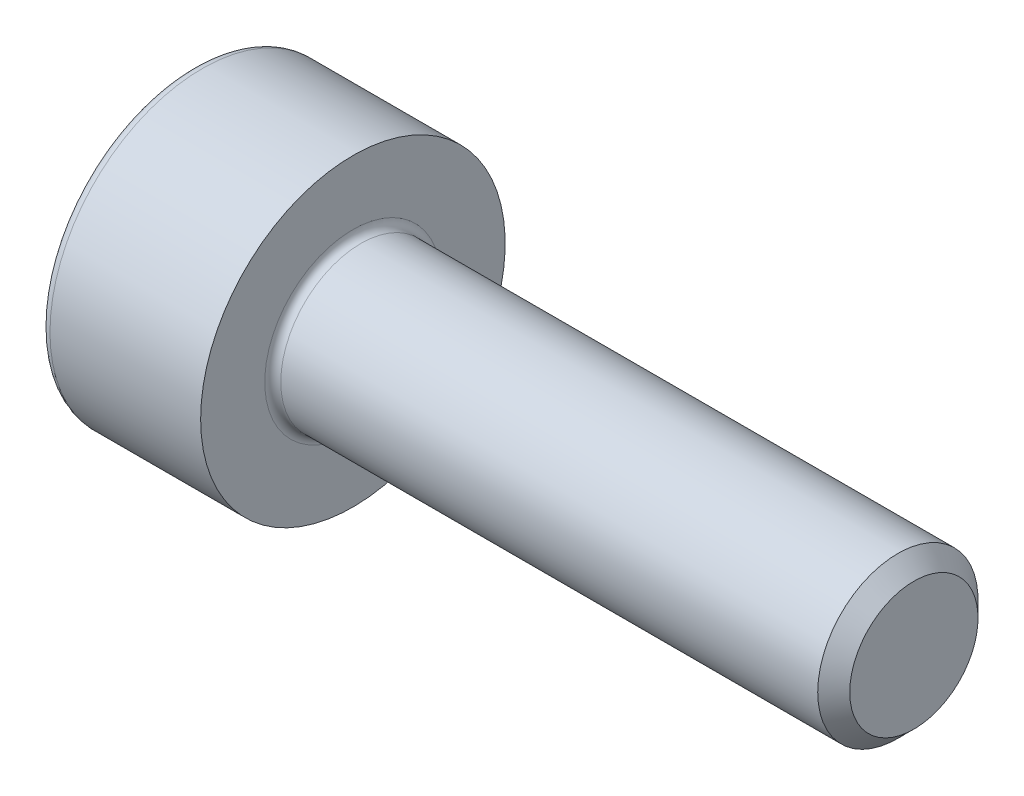
ISO-10303-21;
HEADER;
FILE_DESCRIPTION(('STEP AP214'),'2;1');
FILE_NAME('part.step','',(''),(''),'','','');
FILE_SCHEMA(('AUTOMOTIVE_DESIGN { 1 0 10303 214 1 1 1 1 }'));
ENDSEC;
DATA;
#1=APPLICATION_CONTEXT('core data for automotive mechanical design processes');
#2=APPLICATION_PROTOCOL_DEFINITION('international standard','automotive_design',2000,#1);
#3=PRODUCT_CONTEXT('',#1,'mechanical');
#4=PRODUCT('Part','Part','',(#3));
#5=PRODUCT_RELATED_PRODUCT_CATEGORY('part','',(#4));
#6=PRODUCT_DEFINITION_FORMATION('','',#4);
#7=PRODUCT_DEFINITION_CONTEXT('part definition',#1,'design');
#8=PRODUCT_DEFINITION('design','',#6,#7);
#9=PRODUCT_DEFINITION_SHAPE('','',#8);
#10=(LENGTH_UNIT() NAMED_UNIT(*) SI_UNIT(.MILLI.,.METRE.));
#11=(NAMED_UNIT(*) PLANE_ANGLE_UNIT() SI_UNIT($,.RADIAN.));
#12=(NAMED_UNIT(*) SI_UNIT($,.STERADIAN.) SOLID_ANGLE_UNIT());
#13=UNCERTAINTY_MEASURE_WITH_UNIT(LENGTH_MEASURE(1.E-05),#10,'distance_accuracy_value','');
#14=(GEOMETRIC_REPRESENTATION_CONTEXT(3) GLOBAL_UNCERTAINTY_ASSIGNED_CONTEXT((#13)) GLOBAL_UNIT_ASSIGNED_CONTEXT((#10,
#11,#12)) REPRESENTATION_CONTEXT('',''));
#15=CARTESIAN_POINT('',(0.,0.,0.));
#16=DIRECTION('',(0.,0.,1.));
#17=DIRECTION('',(1.,0.,0.));
#18=AXIS2_PLACEMENT_3D('',#15,#16,#17);
#19=CARTESIAN_POINT('',(9.00000000000477,0.,0.));
#20=DIRECTION('',(-1.,0.,0.));
#21=DIRECTION('',(0.,0.,1.));
#22=AXIS2_PLACEMENT_3D('',#19,#20,#21);
#23=PLANE('',#22);
#24=CARTESIAN_POINT('',(9.00000000000477,0.,0.));
#25=DIRECTION('',(-1.,0.,0.));
#26=DIRECTION('',(0.,0.,1.));
#27=AXIS2_PLACEMENT_3D('',#24,#25,#26);
#28=CIRCLE('',#27,0.800000000000005);
#29=CARTESIAN_POINT('',(9.00000000000477,0.,0.800000000000005));
#30=VERTEX_POINT('',#29);
#31=EDGE_CURVE('E11',#30,#30,#28,.F.);
#32=ORIENTED_EDGE('',*,*,#31,.T.);
#33=EDGE_LOOP('',(#32));
#34=FACE_BOUND('',#33,.T.);
#35=ADVANCED_FACE('F37',(#34),#23,.F.);
#36=CARTESIAN_POINT('',(0.,0.,0.));
#37=DIRECTION('',(-1.,0.,0.));
#38=DIRECTION('',(0.,0.,1.));
#39=AXIS2_PLACEMENT_3D('',#36,#37,#38);
#40=CYLINDRICAL_SURFACE('',#39,1.);
#41=CARTESIAN_POINT('',(8.80000000000478,0.,0.));
#42=DIRECTION('',(-1.,0.,0.));
#43=DIRECTION('',(0.,0.,1.));
#44=AXIS2_PLACEMENT_3D('',#41,#42,#43);
#45=CIRCLE('',#44,1.);
#46=CARTESIAN_POINT('',(8.80000000000478,0.,1.));
#47=VERTEX_POINT('',#46);
#48=EDGE_CURVE('E45',#47,#47,#45,.T.);
#49=ORIENTED_EDGE('',*,*,#48,.T.);
#50=EDGE_LOOP('',(#49));
#51=FACE_BOUND('',#50,.T.);
#52=CARTESIAN_POINT('',(2.10000000000477,0.,0.));
#53=DIRECTION('',(1.,0.,0.));
#54=DIRECTION('',(0.,0.,-1.));
#55=AXIS2_PLACEMENT_3D('',#52,#53,#54);
#56=CIRCLE('',#55,1.);
#57=CARTESIAN_POINT('',(2.10000000000477,0.,-1.));
#58=VERTEX_POINT('',#57);
#59=EDGE_CURVE('E150',#58,#58,#56,.T.);
#60=ORIENTED_EDGE('',*,*,#59,.T.);
#61=EDGE_LOOP('',(#60));
#62=FACE_BOUND('',#61,.T.);
#63=ADVANCED_FACE('F161',(#51,#62),#40,.T.);
#64=CARTESIAN_POINT('',(2.00000000000477,0.,0.));
#65=DIRECTION('',(1.,0.,0.));
#66=DIRECTION('',(0.,0.,-1.));
#67=AXIS2_PLACEMENT_3D('',#64,#65,#66);
#68=PLANE('',#67);
#69=CARTESIAN_POINT('',(2.00000000000477,0.,0.));
#70=DIRECTION('',(1.,0.,0.));
#71=DIRECTION('',(0.,0.,-1.));
#72=AXIS2_PLACEMENT_3D('',#69,#70,#71);
#73=CIRCLE('',#72,1.1);
#74=CARTESIAN_POINT('',(2.00000000000477,0.,-1.1));
#75=VERTEX_POINT('',#74);
#76=EDGE_CURVE('E147',#75,#75,#73,.F.);
#77=ORIENTED_EDGE('',*,*,#76,.T.);
#78=EDGE_LOOP('',(#77));
#79=FACE_BOUND('',#78,.T.);
#80=CARTESIAN_POINT('',(2.00000000000477,0.,0.));
#81=DIRECTION('',(-1.,0.,0.));
#82=DIRECTION('',(0.,0.,1.));
#83=AXIS2_PLACEMENT_3D('',#80,#81,#82);
#84=CIRCLE('',#83,1.9);
#85=CARTESIAN_POINT('',(2.00000000000477,0.,1.9));
#86=VERTEX_POINT('',#85);
#87=EDGE_CURVE('E139',#86,#86,#84,.T.);
#88=ORIENTED_EDGE('',*,*,#87,.F.);
#89=EDGE_LOOP('',(#88));
#90=FACE_BOUND('',#89,.T.);
#91=ADVANCED_FACE('F183',(#79,#90),#68,.T.);
#92=CARTESIAN_POINT('',(0.,0.,0.));
#93=DIRECTION('',(-1.,0.,0.));
#94=DIRECTION('',(0.,0.,1.));
#95=AXIS2_PLACEMENT_3D('',#92,#93,#94);
#96=CYLINDRICAL_SURFACE('',#95,1.9);
#97=CARTESIAN_POINT('',(0.12,0.,0.));
#98=DIRECTION('',(-1.,0.,0.));
#99=DIRECTION('',(0.,0.,1.));
#100=AXIS2_PLACEMENT_3D('',#97,#98,#99);
#101=CIRCLE('',#100,1.9);
#102=CARTESIAN_POINT('',(0.12,0.,1.9));
#103=VERTEX_POINT('',#102);
#104=EDGE_CURVE('E156',#103,#103,#101,.F.);
#105=ORIENTED_EDGE('',*,*,#104,.T.);
#106=EDGE_LOOP('',(#105));
#107=FACE_BOUND('',#106,.T.);
#108=ORIENTED_EDGE('',*,*,#87,.T.);
#109=EDGE_LOOP('',(#108));
#110=FACE_BOUND('',#109,.T.);
#111=ADVANCED_FACE('F193',(#107,#110),#96,.T.);
#112=CARTESIAN_POINT('',(0.,0.,0.));
#113=DIRECTION('',(-1.,0.,0.));
#114=DIRECTION('',(0.,0.,1.));
#115=AXIS2_PLACEMENT_3D('',#112,#113,#114);
#116=PLANE('',#115);
#117=DIRECTION('',(0.,0.5,-0.866025403784439));
#118=VECTOR('',#117,1.);
#119=CARTESIAN_POINT('',(0.,0.43301270189222,0.749999999999999));
#120=LINE('',#119,#118);
#121=CARTESIAN_POINT('',(0.,0.43301270189222,0.749999999999999));
#122=VERTEX_POINT('',#121);
#123=CARTESIAN_POINT('',(0.,0.866025403784438,0.));
#124=VERTEX_POINT('',#123);
#125=EDGE_CURVE('E52',#122,#124,#120,.T.);
#126=ORIENTED_EDGE('',*,*,#125,.F.);
#127=DIRECTION('',(0.,1.,0.));
#128=VECTOR('',#127,1.);
#129=CARTESIAN_POINT('',(0.,-0.43301270189222,0.749999999999999));
#130=LINE('',#129,#128);
#131=CARTESIAN_POINT('',(0.,-0.43301270189222,0.749999999999999));
#132=VERTEX_POINT('',#131);
#133=EDGE_CURVE('E135',#132,#122,#130,.T.);
#134=ORIENTED_EDGE('',*,*,#133,.F.);
#135=DIRECTION('',(0.,0.5,0.866025403784439));
#136=VECTOR('',#135,1.);
#137=CARTESIAN_POINT('',(0.,-0.866025403784438,0.));
#138=LINE('',#137,#136);
#139=CARTESIAN_POINT('',(0.,-0.866025403784438,0.));
#140=VERTEX_POINT('',#139);
#141=EDGE_CURVE('E133',#140,#132,#138,.T.);
#142=ORIENTED_EDGE('',*,*,#141,.F.);
#143=DIRECTION('',(0.,-0.5,0.866025403784439));
#144=VECTOR('',#143,1.);
#145=CARTESIAN_POINT('',(0.,-0.433012701892219,-0.75));
#146=LINE('',#145,#144);
#147=CARTESIAN_POINT('',(0.,-0.433012701892219,-0.75));
#148=VERTEX_POINT('',#147);
#149=EDGE_CURVE('E100',#148,#140,#146,.T.);
#150=ORIENTED_EDGE('',*,*,#149,.F.);
#151=DIRECTION('',(0.,-1.,0.));
#152=VECTOR('',#151,1.);
#153=CARTESIAN_POINT('',(0.,0.433012701892219,-0.75));
#154=LINE('',#153,#152);
#155=CARTESIAN_POINT('',(0.,0.433012701892219,-0.75));
#156=VERTEX_POINT('',#155);
#157=EDGE_CURVE('E129',#156,#148,#154,.T.);
#158=ORIENTED_EDGE('',*,*,#157,.F.);
#159=DIRECTION('',(0.,-0.5,-0.866025403784439));
#160=VECTOR('',#159,1.);
#161=CARTESIAN_POINT('',(0.,0.866025403784438,0.));
#162=LINE('',#161,#160);
#163=EDGE_CURVE('E126',#124,#156,#162,.T.);
#164=ORIENTED_EDGE('',*,*,#163,.F.);
#165=EDGE_LOOP('',(#126,#134,#142,#150,#158,#164));
#166=FACE_BOUND('',#165,.T.);
#167=CARTESIAN_POINT('',(0.,0.,0.));
#168=DIRECTION('',(-1.,0.,0.));
#169=DIRECTION('',(0.,0.,1.));
#170=AXIS2_PLACEMENT_3D('',#167,#168,#169);
#171=CIRCLE('',#170,1.78);
#172=CARTESIAN_POINT('',(0.,0.,1.78));
#173=VERTEX_POINT('',#172);
#174=EDGE_CURVE('E153',#173,#173,#171,.T.);
#175=ORIENTED_EDGE('',*,*,#174,.T.);
#176=EDGE_LOOP('',(#175));
#177=FACE_BOUND('',#176,.T.);
#178=ADVANCED_FACE('F188',(#166,#177),#116,.T.);
#179=CARTESIAN_POINT('',(2.10000000000477,0.,0.));
#180=DIRECTION('',(1.,0.,0.));
#181=DIRECTION('',(0.,0.,-1.));
#182=AXIS2_PLACEMENT_3D('',#179,#180,#181);
#183=TOROIDAL_SURFACE('',#182,1.1,0.1);
#184=ORIENTED_EDGE('',*,*,#59,.F.);
#185=EDGE_LOOP('',(#184));
#186=FACE_BOUND('',#185,.T.);
#187=ORIENTED_EDGE('',*,*,#76,.F.);
#188=EDGE_LOOP('',(#187));
#189=FACE_BOUND('',#188,.T.);
#190=ADVANCED_FACE('F174',(#186,#189),#183,.F.);
#191=CARTESIAN_POINT('',(0.12,0.,0.));
#192=DIRECTION('',(-1.,0.,0.));
#193=DIRECTION('',(0.,0.,1.));
#194=AXIS2_PLACEMENT_3D('',#191,#192,#193);
#195=TOROIDAL_SURFACE('',#194,1.78,0.12);
#196=ORIENTED_EDGE('',*,*,#104,.F.);
#197=EDGE_LOOP('',(#196));
#198=FACE_BOUND('',#197,.T.);
#199=ORIENTED_EDGE('',*,*,#174,.F.);
#200=EDGE_LOOP('',(#199));
#201=FACE_BOUND('',#200,.T.);
#202=ADVANCED_FACE('F166',(#198,#201),#195,.T.);
#203=CARTESIAN_POINT('',(8.80000000000478,0.,0.));
#204=DIRECTION('',(-1.,0.,0.));
#205=DIRECTION('',(0.,0.,1.));
#206=AXIS2_PLACEMENT_3D('',#203,#204,#205);
#207=CONICAL_SURFACE('',#206,1.,0.785398163397446);
#208=ORIENTED_EDGE('',*,*,#31,.F.);
#209=EDGE_LOOP('',(#208));
#210=FACE_BOUND('',#209,.T.);
#211=ORIENTED_EDGE('',*,*,#48,.F.);
#212=EDGE_LOOP('',(#211));
#213=FACE_BOUND('',#212,.T.);
#214=ADVANCED_FACE('F39',(#210,#213),#207,.T.);
#215=CARTESIAN_POINT('',(1.,0.43301270189222,0.749999999999999));
#216=DIRECTION('',(0.,0.866025403784439,0.5));
#217=DIRECTION('',(0.,-0.5,0.866025403784439));
#218=AXIS2_PLACEMENT_3D('',#215,#216,#217);
#219=PLANE('',#218);
#220=ORIENTED_EDGE('',*,*,#125,.T.);
#221=DIRECTION('',(-1.,0.,0.));
#222=VECTOR('',#221,1.);
#223=CARTESIAN_POINT('',(1.,0.866025403784438,0.));
#224=LINE('',#223,#222);
#225=CARTESIAN_POINT('',(1.,0.866025403784438,0.));
#226=VERTEX_POINT('',#225);
#227=EDGE_CURVE('E82',#226,#124,#224,.T.);
#228=ORIENTED_EDGE('',*,*,#227,.F.);
#229=DIRECTION('',(0.,0.5,-0.866025403784439));
#230=VECTOR('',#229,1.);
#231=CARTESIAN_POINT('',(1.,0.43301270189222,0.749999999999999));
#232=LINE('',#231,#230);
#233=CARTESIAN_POINT('',(1.,0.43301270189222,0.749999999999999));
#234=VERTEX_POINT('',#233);
#235=EDGE_CURVE('E137',#234,#226,#232,.T.);
#236=ORIENTED_EDGE('',*,*,#235,.F.);
#237=DIRECTION('',(-1.,0.,0.));
#238=VECTOR('',#237,1.);
#239=CARTESIAN_POINT('',(1.,0.43301270189222,0.749999999999999));
#240=LINE('',#239,#238);
#241=EDGE_CURVE('E60',#234,#122,#240,.T.);
#242=ORIENTED_EDGE('',*,*,#241,.T.);
#243=EDGE_LOOP('',(#220,#228,#236,#242));
#244=FACE_BOUND('',#243,.T.);
#245=ADVANCED_FACE('F165',(#244),#219,.F.);
#246=CARTESIAN_POINT('',(1.,-0.43301270189222,0.749999999999999));
#247=DIRECTION('',(0.,0.,1.));
#248=DIRECTION('',(0.,-1.,0.));
#249=AXIS2_PLACEMENT_3D('',#246,#247,#248);
#250=PLANE('',#249);
#251=ORIENTED_EDGE('',*,*,#133,.T.);
#252=ORIENTED_EDGE('',*,*,#241,.F.);
#253=DIRECTION('',(0.,1.,0.));
#254=VECTOR('',#253,1.);
#255=CARTESIAN_POINT('',(1.,-0.43301270189222,0.749999999999999));
#256=LINE('',#255,#254);
#257=CARTESIAN_POINT('',(1.,-0.43301270189222,0.749999999999999));
#258=VERTEX_POINT('',#257);
#259=EDGE_CURVE('E112',#258,#234,#256,.T.);
#260=ORIENTED_EDGE('',*,*,#259,.F.);
#261=DIRECTION('',(-1.,0.,0.));
#262=VECTOR('',#261,1.);
#263=CARTESIAN_POINT('',(1.,-0.43301270189222,0.749999999999999));
#264=LINE('',#263,#262);
#265=EDGE_CURVE('E104',#258,#132,#264,.T.);
#266=ORIENTED_EDGE('',*,*,#265,.T.);
#267=EDGE_LOOP('',(#251,#252,#260,#266));
#268=FACE_BOUND('',#267,.T.);
#269=ADVANCED_FACE('F172',(#268),#250,.F.);
#270=CARTESIAN_POINT('',(1.,-0.866025403784438,0.));
#271=DIRECTION('',(0.,-0.866025403784439,0.5));
#272=DIRECTION('',(0.,-0.5,-0.866025403784439));
#273=AXIS2_PLACEMENT_3D('',#270,#271,#272);
#274=PLANE('',#273);
#275=ORIENTED_EDGE('',*,*,#141,.T.);
#276=ORIENTED_EDGE('',*,*,#265,.F.);
#277=DIRECTION('',(0.,0.5,0.866025403784439));
#278=VECTOR('',#277,1.);
#279=CARTESIAN_POINT('',(1.,-0.866025403784438,0.));
#280=LINE('',#279,#278);
#281=CARTESIAN_POINT('',(1.,-0.866025403784438,0.));
#282=VERTEX_POINT('',#281);
#283=EDGE_CURVE('E108',#282,#258,#280,.T.);
#284=ORIENTED_EDGE('',*,*,#283,.F.);
#285=DIRECTION('',(-1.,0.,0.));
#286=VECTOR('',#285,1.);
#287=CARTESIAN_POINT('',(1.,-0.866025403784438,0.));
#288=LINE('',#287,#286);
#289=EDGE_CURVE('E93',#282,#140,#288,.T.);
#290=ORIENTED_EDGE('',*,*,#289,.T.);
#291=EDGE_LOOP('',(#275,#276,#284,#290));
#292=FACE_BOUND('',#291,.T.);
#293=ADVANCED_FACE('F109',(#292),#274,.F.);
#294=CARTESIAN_POINT('',(1.,-0.433012701892219,-0.75));
#295=DIRECTION('',(0.,-0.866025403784439,-0.5));
#296=DIRECTION('',(0.,0.5,-0.866025403784439));
#297=AXIS2_PLACEMENT_3D('',#294,#295,#296);
#298=PLANE('',#297);
#299=ORIENTED_EDGE('',*,*,#149,.T.);
#300=ORIENTED_EDGE('',*,*,#289,.F.);
#301=DIRECTION('',(0.,-0.5,0.866025403784439));
#302=VECTOR('',#301,1.);
#303=CARTESIAN_POINT('',(1.,-0.433012701892219,-0.75));
#304=LINE('',#303,#302);
#305=CARTESIAN_POINT('',(1.,-0.433012701892219,-0.75));
#306=VERTEX_POINT('',#305);
#307=EDGE_CURVE('E97',#306,#282,#304,.T.);
#308=ORIENTED_EDGE('',*,*,#307,.F.);
#309=DIRECTION('',(-1.,0.,0.));
#310=VECTOR('',#309,1.);
#311=CARTESIAN_POINT('',(1.,-0.433012701892219,-0.75));
#312=LINE('',#311,#310);
#313=EDGE_CURVE('E105',#306,#148,#312,.T.);
#314=ORIENTED_EDGE('',*,*,#313,.T.);
#315=EDGE_LOOP('',(#299,#300,#308,#314));
#316=FACE_BOUND('',#315,.T.);
#317=ADVANCED_FACE('F95',(#316),#298,.F.);
#318=CARTESIAN_POINT('',(1.,0.433012701892219,-0.75));
#319=DIRECTION('',(0.,0.,-1.));
#320=DIRECTION('',(0.,1.,0.));
#321=AXIS2_PLACEMENT_3D('',#318,#319,#320);
#322=PLANE('',#321);
#323=ORIENTED_EDGE('',*,*,#157,.T.);
#324=ORIENTED_EDGE('',*,*,#313,.F.);
#325=DIRECTION('',(0.,-1.,0.));
#326=VECTOR('',#325,1.);
#327=CARTESIAN_POINT('',(1.,0.433012701892219,-0.75));
#328=LINE('',#327,#326);
#329=CARTESIAN_POINT('',(1.,0.433012701892219,-0.75));
#330=VERTEX_POINT('',#329);
#331=EDGE_CURVE('E118',#330,#306,#328,.T.);
#332=ORIENTED_EDGE('',*,*,#331,.F.);
#333=DIRECTION('',(-1.,0.,0.));
#334=VECTOR('',#333,1.);
#335=CARTESIAN_POINT('',(1.,0.433012701892219,-0.75));
#336=LINE('',#335,#334);
#337=EDGE_CURVE('E142',#330,#156,#336,.T.);
#338=ORIENTED_EDGE('',*,*,#337,.T.);
#339=EDGE_LOOP('',(#323,#324,#332,#338));
#340=FACE_BOUND('',#339,.T.);
#341=ADVANCED_FACE('F213',(#340),#322,.F.);
#342=CARTESIAN_POINT('',(1.,0.866025403784438,0.));
#343=DIRECTION('',(0.,0.866025403784439,-0.5));
#344=DIRECTION('',(0.,0.5,0.866025403784439));
#345=AXIS2_PLACEMENT_3D('',#342,#343,#344);
#346=PLANE('',#345);
#347=ORIENTED_EDGE('',*,*,#163,.T.);
#348=ORIENTED_EDGE('',*,*,#337,.F.);
#349=DIRECTION('',(0.,-0.5,-0.866025403784439));
#350=VECTOR('',#349,1.);
#351=CARTESIAN_POINT('',(1.,0.866025403784438,0.));
#352=LINE('',#351,#350);
#353=EDGE_CURVE('E120',#226,#330,#352,.T.);
#354=ORIENTED_EDGE('',*,*,#353,.F.);
#355=ORIENTED_EDGE('',*,*,#227,.T.);
#356=EDGE_LOOP('',(#347,#348,#354,#355));
#357=FACE_BOUND('',#356,.T.);
#358=ADVANCED_FACE('F210',(#357),#346,.F.);
#359=CARTESIAN_POINT('',(1.,0.,0.));
#360=DIRECTION('',(-1.,0.,0.));
#361=DIRECTION('',(0.,0.,1.));
#362=AXIS2_PLACEMENT_3D('',#359,#360,#361);
#363=PLANE('',#362);
#364=ORIENTED_EDGE('',*,*,#235,.T.);
#365=ORIENTED_EDGE('',*,*,#353,.T.);
#366=ORIENTED_EDGE('',*,*,#331,.T.);
#367=ORIENTED_EDGE('',*,*,#307,.T.);
#368=ORIENTED_EDGE('',*,*,#283,.T.);
#369=ORIENTED_EDGE('',*,*,#259,.T.);
#370=EDGE_LOOP('',(#364,#365,#366,#367,#368,#369));
#371=FACE_BOUND('',#370,.T.);
#372=ADVANCED_FACE('F115',(#371),#363,.T.);
#373=CLOSED_SHELL('',(#35,#63,#91,#111,#178,#190,#202,#214,#245,#269,#293,#317,#341,#358,#372));
#374=MANIFOLD_SOLID_BREP('B2',#373);
#375=ADVANCED_BREP_SHAPE_REPRESENTATION('',(#18,#374),#14);
#376=SHAPE_DEFINITION_REPRESENTATION(#9,#375);
ENDSEC;
END-ISO-10303-21;
